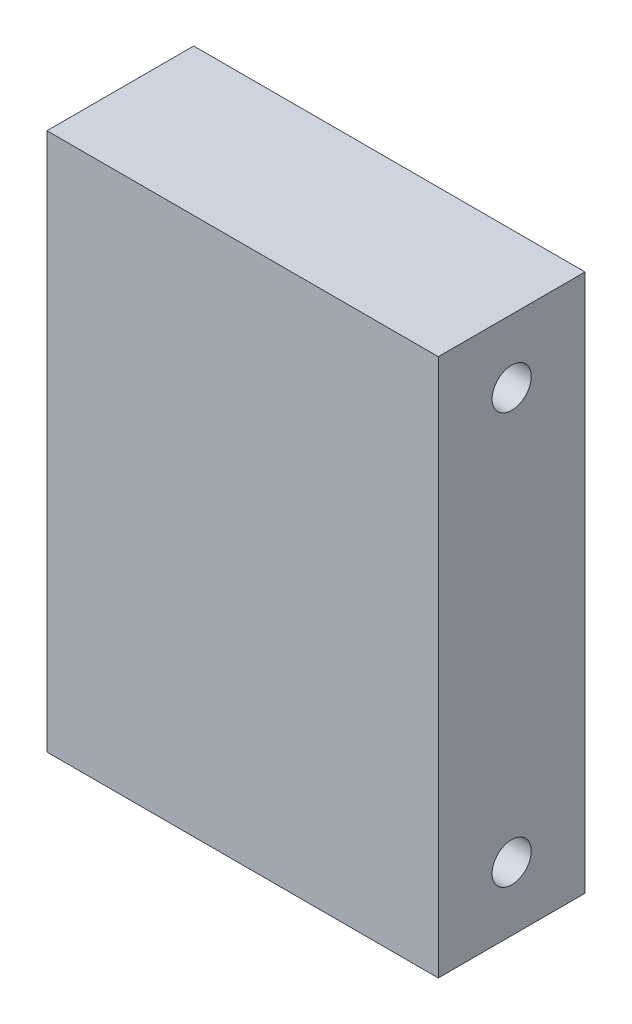
ISO-10303-21;
HEADER;
FILE_DESCRIPTION(('STEP AP214'),'2;1');
FILE_NAME('part.step','',(''),(''),'','','');
FILE_SCHEMA(('AUTOMOTIVE_DESIGN { 1 0 10303 214 1 1 1 1 }'));
ENDSEC;
DATA;
#1=APPLICATION_CONTEXT('core data for automotive mechanical design processes');
#2=APPLICATION_PROTOCOL_DEFINITION('international standard','automotive_design',2000,#1);
#3=PRODUCT_CONTEXT('',#1,'mechanical');
#4=PRODUCT('Part','Part','',(#3));
#5=PRODUCT_RELATED_PRODUCT_CATEGORY('part','',(#4));
#6=PRODUCT_DEFINITION_FORMATION('','',#4);
#7=PRODUCT_DEFINITION_CONTEXT('part definition',#1,'design');
#8=PRODUCT_DEFINITION('design','',#6,#7);
#9=PRODUCT_DEFINITION_SHAPE('','',#8);
#10=(LENGTH_UNIT() NAMED_UNIT(*) SI_UNIT(.MILLI.,.METRE.));
#11=(NAMED_UNIT(*) PLANE_ANGLE_UNIT() SI_UNIT($,.RADIAN.));
#12=(NAMED_UNIT(*) SI_UNIT($,.STERADIAN.) SOLID_ANGLE_UNIT());
#13=UNCERTAINTY_MEASURE_WITH_UNIT(LENGTH_MEASURE(1.E-05),#10,'distance_accuracy_value','');
#14=(GEOMETRIC_REPRESENTATION_CONTEXT(3) GLOBAL_UNCERTAINTY_ASSIGNED_CONTEXT((#13)) GLOBAL_UNIT_ASSIGNED_CONTEXT((#10,
#11,#12)) REPRESENTATION_CONTEXT('',''));
#15=CARTESIAN_POINT('',(0.,0.,0.));
#16=DIRECTION('',(0.,0.,1.));
#17=DIRECTION('',(1.,0.,0.));
#18=AXIS2_PLACEMENT_3D('',#15,#16,#17);
#19=CARTESIAN_POINT('',(-20.,27.5,15.));
#20=DIRECTION('',(1.,0.,0.));
#21=DIRECTION('',(0.,1.,0.));
#22=AXIS2_PLACEMENT_3D('',#19,#20,#21);
#23=PLANE('',#22);
#24=CARTESIAN_POINT('',(-20.,-21.,7.5));
#25=DIRECTION('',(-1.,0.,0.));
#26=DIRECTION('',(0.,-1.,0.));
#27=AXIS2_PLACEMENT_3D('',#24,#25,#26);
#28=CIRCLE('',#27,2.);
#29=CARTESIAN_POINT('',(-20.,-23.,7.5));
#30=VERTEX_POINT('',#29);
#31=EDGE_CURVE('E127',#30,#30,#28,.T.);
#32=ORIENTED_EDGE('',*,*,#31,.F.);
#33=EDGE_LOOP('',(#32));
#34=FACE_BOUND('',#33,.T.);
#35=CARTESIAN_POINT('',(-20.,21.,7.5));
#36=DIRECTION('',(-1.,0.,0.));
#37=DIRECTION('',(0.,-1.,0.));
#38=AXIS2_PLACEMENT_3D('',#35,#36,#37);
#39=CIRCLE('',#38,2.);
#40=CARTESIAN_POINT('',(-20.,19.,7.5));
#41=VERTEX_POINT('',#40);
#42=EDGE_CURVE('E121',#41,#41,#39,.T.);
#43=ORIENTED_EDGE('',*,*,#42,.F.);
#44=EDGE_LOOP('',(#43));
#45=FACE_BOUND('',#44,.T.);
#46=DIRECTION('',(0.,-1.,0.));
#47=VECTOR('',#46,1.);
#48=CARTESIAN_POINT('',(-20.,27.5,0.));
#49=LINE('',#48,#47);
#50=CARTESIAN_POINT('',(-20.,27.5,0.));
#51=VERTEX_POINT('',#50);
#52=CARTESIAN_POINT('',(-20.,-27.5,0.));
#53=VERTEX_POINT('',#52);
#54=EDGE_CURVE('E95',#51,#53,#49,.T.);
#55=ORIENTED_EDGE('',*,*,#54,.T.);
#56=DIRECTION('',(0.,0.,-1.));
#57=VECTOR('',#56,1.);
#58=CARTESIAN_POINT('',(-20.,-27.5,15.));
#59=LINE('',#58,#57);
#60=CARTESIAN_POINT('',(-20.,-27.5,15.));
#61=VERTEX_POINT('',#60);
#62=EDGE_CURVE('E11',#61,#53,#59,.T.);
#63=ORIENTED_EDGE('',*,*,#62,.F.);
#64=DIRECTION('',(0.,-1.,0.));
#65=VECTOR('',#64,1.);
#66=CARTESIAN_POINT('',(-20.,27.5,15.));
#67=LINE('',#66,#65);
#68=CARTESIAN_POINT('',(-20.,27.5,15.));
#69=VERTEX_POINT('',#68);
#70=EDGE_CURVE('E83',#69,#61,#67,.T.);
#71=ORIENTED_EDGE('',*,*,#70,.F.);
#72=DIRECTION('',(0.,0.,-1.));
#73=VECTOR('',#72,1.);
#74=CARTESIAN_POINT('',(-20.,27.5,15.));
#75=LINE('',#74,#73);
#76=EDGE_CURVE('E91',#69,#51,#75,.T.);
#77=ORIENTED_EDGE('',*,*,#76,.T.);
#78=EDGE_LOOP('',(#55,#63,#71,#77));
#79=FACE_BOUND('',#78,.T.);
#80=ADVANCED_FACE('F32',(#34,#45,#79),#23,.F.);
#81=CARTESIAN_POINT('',(-20.,-27.5,15.));
#82=DIRECTION('',(0.,1.,0.));
#83=DIRECTION('',(0.,0.,1.));
#84=AXIS2_PLACEMENT_3D('',#81,#82,#83);
#85=PLANE('',#84);
#86=DIRECTION('',(1.,0.,0.));
#87=VECTOR('',#86,1.);
#88=CARTESIAN_POINT('',(-20.,-27.5,0.));
#89=LINE('',#88,#87);
#90=CARTESIAN_POINT('',(20.,-27.5,0.));
#91=VERTEX_POINT('',#90);
#92=EDGE_CURVE('E87',#53,#91,#89,.T.);
#93=ORIENTED_EDGE('',*,*,#92,.T.);
#94=DIRECTION('',(0.,0.,-1.));
#95=VECTOR('',#94,1.);
#96=CARTESIAN_POINT('',(20.,-27.5,15.));
#97=LINE('',#96,#95);
#98=CARTESIAN_POINT('',(20.,-27.5,15.));
#99=VERTEX_POINT('',#98);
#100=EDGE_CURVE('E40',#99,#91,#97,.T.);
#101=ORIENTED_EDGE('',*,*,#100,.F.);
#102=DIRECTION('',(1.,0.,0.));
#103=VECTOR('',#102,1.);
#104=CARTESIAN_POINT('',(-20.,-27.5,15.));
#105=LINE('',#104,#103);
#106=EDGE_CURVE('E78',#61,#99,#105,.T.);
#107=ORIENTED_EDGE('',*,*,#106,.F.);
#108=ORIENTED_EDGE('',*,*,#62,.T.);
#109=EDGE_LOOP('',(#93,#101,#107,#108));
#110=FACE_BOUND('',#109,.T.);
#111=ADVANCED_FACE('F86',(#110),#85,.F.);
#112=CARTESIAN_POINT('',(20.,27.5,15.));
#113=DIRECTION('',(-1.,0.,0.));
#114=DIRECTION('',(0.,-1.,0.));
#115=AXIS2_PLACEMENT_3D('',#112,#113,#114);
#116=PLANE('',#115);
#117=CARTESIAN_POINT('',(20.,-21.,7.5));
#118=DIRECTION('',(1.,0.,0.));
#119=DIRECTION('',(0.,1.,0.));
#120=AXIS2_PLACEMENT_3D('',#117,#118,#119);
#121=CIRCLE('',#120,2.);
#122=CARTESIAN_POINT('',(20.,-19.,7.5));
#123=VERTEX_POINT('',#122);
#124=EDGE_CURVE('E115',#123,#123,#121,.T.);
#125=ORIENTED_EDGE('',*,*,#124,.F.);
#126=EDGE_LOOP('',(#125));
#127=FACE_BOUND('',#126,.T.);
#128=CARTESIAN_POINT('',(20.,21.,7.5));
#129=DIRECTION('',(1.,0.,0.));
#130=DIRECTION('',(0.,1.,0.));
#131=AXIS2_PLACEMENT_3D('',#128,#129,#130);
#132=CIRCLE('',#131,2.);
#133=CARTESIAN_POINT('',(20.,23.,7.5));
#134=VERTEX_POINT('',#133);
#135=EDGE_CURVE('E109',#134,#134,#132,.T.);
#136=ORIENTED_EDGE('',*,*,#135,.F.);
#137=EDGE_LOOP('',(#136));
#138=FACE_BOUND('',#137,.T.);
#139=DIRECTION('',(0.,1.,0.));
#140=VECTOR('',#139,1.);
#141=CARTESIAN_POINT('',(20.,27.5,0.));
#142=LINE('',#141,#140);
#143=CARTESIAN_POINT('',(20.,27.5,0.));
#144=VERTEX_POINT('',#143);
#145=EDGE_CURVE('E65',#91,#144,#142,.T.);
#146=ORIENTED_EDGE('',*,*,#145,.T.);
#147=DIRECTION('',(0.,0.,-1.));
#148=VECTOR('',#147,1.);
#149=CARTESIAN_POINT('',(20.,27.5,15.));
#150=LINE('',#149,#148);
#151=CARTESIAN_POINT('',(20.,27.5,15.));
#152=VERTEX_POINT('',#151);
#153=EDGE_CURVE('E88',#152,#144,#150,.T.);
#154=ORIENTED_EDGE('',*,*,#153,.F.);
#155=DIRECTION('',(0.,1.,0.));
#156=VECTOR('',#155,1.);
#157=CARTESIAN_POINT('',(20.,27.5,15.));
#158=LINE('',#157,#156);
#159=EDGE_CURVE('E81',#99,#152,#158,.T.);
#160=ORIENTED_EDGE('',*,*,#159,.F.);
#161=ORIENTED_EDGE('',*,*,#100,.T.);
#162=EDGE_LOOP('',(#146,#154,#160,#161));
#163=FACE_BOUND('',#162,.T.);
#164=ADVANCED_FACE('F89',(#127,#138,#163),#116,.F.);
#165=CARTESIAN_POINT('',(-20.,27.5,15.));
#166=DIRECTION('',(0.,-1.,0.));
#167=DIRECTION('',(1.,0.,0.));
#168=AXIS2_PLACEMENT_3D('',#165,#166,#167);
#169=PLANE('',#168);
#170=DIRECTION('',(-1.,0.,0.));
#171=VECTOR('',#170,1.);
#172=CARTESIAN_POINT('',(-20.,27.5,0.));
#173=LINE('',#172,#171);
#174=EDGE_CURVE('E71',#144,#51,#173,.T.);
#175=ORIENTED_EDGE('',*,*,#174,.T.);
#176=ORIENTED_EDGE('',*,*,#76,.F.);
#177=DIRECTION('',(-1.,0.,0.));
#178=VECTOR('',#177,1.);
#179=CARTESIAN_POINT('',(-20.,27.5,15.));
#180=LINE('',#179,#178);
#181=EDGE_CURVE('E48',#152,#69,#180,.T.);
#182=ORIENTED_EDGE('',*,*,#181,.F.);
#183=ORIENTED_EDGE('',*,*,#153,.T.);
#184=EDGE_LOOP('',(#175,#176,#182,#183));
#185=FACE_BOUND('',#184,.T.);
#186=ADVANCED_FACE('F103',(#185),#169,.F.);
#187=CARTESIAN_POINT('',(0.,0.,15.));
#188=DIRECTION('',(0.,0.,1.));
#189=DIRECTION('',(1.,0.,0.));
#190=AXIS2_PLACEMENT_3D('',#187,#188,#189);
#191=PLANE('',#190);
#192=ORIENTED_EDGE('',*,*,#70,.T.);
#193=ORIENTED_EDGE('',*,*,#106,.T.);
#194=ORIENTED_EDGE('',*,*,#159,.T.);
#195=ORIENTED_EDGE('',*,*,#181,.T.);
#196=EDGE_LOOP('',(#192,#193,#194,#195));
#197=FACE_BOUND('',#196,.T.);
#198=ADVANCED_FACE('F79',(#197),#191,.T.);
#199=CARTESIAN_POINT('',(0.,0.,0.));
#200=DIRECTION('',(0.,0.,1.));
#201=DIRECTION('',(1.,0.,0.));
#202=AXIS2_PLACEMENT_3D('',#199,#200,#201);
#203=PLANE('',#202);
#204=ORIENTED_EDGE('',*,*,#54,.F.);
#205=ORIENTED_EDGE('',*,*,#174,.F.);
#206=ORIENTED_EDGE('',*,*,#145,.F.);
#207=ORIENTED_EDGE('',*,*,#92,.F.);
#208=EDGE_LOOP('',(#204,#205,#206,#207));
#209=FACE_BOUND('',#208,.T.);
#210=ADVANCED_FACE('F106',(#209),#203,.F.);
#211=CARTESIAN_POINT('',(15.,21.,7.5));
#212=DIRECTION('',(1.,0.,0.));
#213=DIRECTION('',(0.,1.,0.));
#214=AXIS2_PLACEMENT_3D('',#211,#212,#213);
#215=CYLINDRICAL_SURFACE('',#214,2.);
#216=CARTESIAN_POINT('',(15.,21.,7.5));
#217=DIRECTION('',(1.,0.,0.));
#218=DIRECTION('',(0.,1.,0.));
#219=AXIS2_PLACEMENT_3D('',#216,#217,#218);
#220=CIRCLE('',#219,2.);
#221=CARTESIAN_POINT('',(15.,23.,7.5));
#222=VERTEX_POINT('',#221);
#223=EDGE_CURVE('E98',#222,#222,#220,.T.);
#224=ORIENTED_EDGE('',*,*,#223,.F.);
#225=EDGE_LOOP('',(#224));
#226=FACE_BOUND('',#225,.T.);
#227=ORIENTED_EDGE('',*,*,#135,.T.);
#228=EDGE_LOOP('',(#227));
#229=FACE_BOUND('',#228,.T.);
#230=ADVANCED_FACE('F168',(#226,#229),#215,.F.);
#231=CARTESIAN_POINT('',(15.,21.,7.5));
#232=DIRECTION('',(1.,0.,0.));
#233=DIRECTION('',(0.,1.,0.));
#234=AXIS2_PLACEMENT_3D('',#231,#232,#233);
#235=PLANE('',#234);
#236=ORIENTED_EDGE('',*,*,#223,.T.);
#237=EDGE_LOOP('',(#236));
#238=FACE_BOUND('',#237,.T.);
#239=ADVANCED_FACE('F164',(#238),#235,.T.);
#240=CARTESIAN_POINT('',(15.,-21.,7.5));
#241=DIRECTION('',(1.,0.,0.));
#242=DIRECTION('',(0.,1.,0.));
#243=AXIS2_PLACEMENT_3D('',#240,#241,#242);
#244=CYLINDRICAL_SURFACE('',#243,2.);
#245=CARTESIAN_POINT('',(15.,-21.,7.5));
#246=DIRECTION('',(1.,0.,0.));
#247=DIRECTION('',(0.,1.,0.));
#248=AXIS2_PLACEMENT_3D('',#245,#246,#247);
#249=CIRCLE('',#248,2.);
#250=CARTESIAN_POINT('',(15.,-19.,7.5));
#251=VERTEX_POINT('',#250);
#252=EDGE_CURVE('E112',#251,#251,#249,.T.);
#253=ORIENTED_EDGE('',*,*,#252,.F.);
#254=EDGE_LOOP('',(#253));
#255=FACE_BOUND('',#254,.T.);
#256=ORIENTED_EDGE('',*,*,#124,.T.);
#257=EDGE_LOOP('',(#256));
#258=FACE_BOUND('',#257,.T.);
#259=ADVANCED_FACE('F157',(#255,#258),#244,.F.);
#260=CARTESIAN_POINT('',(15.,-21.,7.5));
#261=DIRECTION('',(1.,0.,0.));
#262=DIRECTION('',(0.,1.,0.));
#263=AXIS2_PLACEMENT_3D('',#260,#261,#262);
#264=PLANE('',#263);
#265=ORIENTED_EDGE('',*,*,#252,.T.);
#266=EDGE_LOOP('',(#265));
#267=FACE_BOUND('',#266,.T.);
#268=ADVANCED_FACE('F148',(#267),#264,.T.);
#269=CARTESIAN_POINT('',(-15.,21.,7.5));
#270=DIRECTION('',(-1.,0.,0.));
#271=DIRECTION('',(0.,-1.,0.));
#272=AXIS2_PLACEMENT_3D('',#269,#270,#271);
#273=CYLINDRICAL_SURFACE('',#272,2.);
#274=CARTESIAN_POINT('',(-15.,21.,7.5));
#275=DIRECTION('',(-1.,0.,0.));
#276=DIRECTION('',(0.,-1.,0.));
#277=AXIS2_PLACEMENT_3D('',#274,#275,#276);
#278=CIRCLE('',#277,2.);
#279=CARTESIAN_POINT('',(-15.,19.,7.5));
#280=VERTEX_POINT('',#279);
#281=EDGE_CURVE('E118',#280,#280,#278,.T.);
#282=ORIENTED_EDGE('',*,*,#281,.F.);
#283=EDGE_LOOP('',(#282));
#284=FACE_BOUND('',#283,.T.);
#285=ORIENTED_EDGE('',*,*,#42,.T.);
#286=EDGE_LOOP('',(#285));
#287=FACE_BOUND('',#286,.T.);
#288=ADVANCED_FACE('F146',(#284,#287),#273,.F.);
#289=CARTESIAN_POINT('',(-15.,21.,7.5));
#290=DIRECTION('',(-1.,0.,0.));
#291=DIRECTION('',(0.,-1.,0.));
#292=AXIS2_PLACEMENT_3D('',#289,#290,#291);
#293=PLANE('',#292);
#294=ORIENTED_EDGE('',*,*,#281,.T.);
#295=EDGE_LOOP('',(#294));
#296=FACE_BOUND('',#295,.T.);
#297=ADVANCED_FACE('F138',(#296),#293,.T.);
#298=CARTESIAN_POINT('',(-15.,-21.,7.5));
#299=DIRECTION('',(-1.,0.,0.));
#300=DIRECTION('',(0.,-1.,0.));
#301=AXIS2_PLACEMENT_3D('',#298,#299,#300);
#302=CYLINDRICAL_SURFACE('',#301,2.);
#303=CARTESIAN_POINT('',(-15.,-21.,7.5));
#304=DIRECTION('',(-1.,0.,0.));
#305=DIRECTION('',(0.,-1.,0.));
#306=AXIS2_PLACEMENT_3D('',#303,#304,#305);
#307=CIRCLE('',#306,2.);
#308=CARTESIAN_POINT('',(-15.,-23.,7.5));
#309=VERTEX_POINT('',#308);
#310=EDGE_CURVE('E124',#309,#309,#307,.T.);
#311=ORIENTED_EDGE('',*,*,#310,.F.);
#312=EDGE_LOOP('',(#311));
#313=FACE_BOUND('',#312,.T.);
#314=ORIENTED_EDGE('',*,*,#31,.T.);
#315=EDGE_LOOP('',(#314));
#316=FACE_BOUND('',#315,.T.);
#317=ADVANCED_FACE('F135',(#313,#316),#302,.F.);
#318=CARTESIAN_POINT('',(-15.,-21.,7.5));
#319=DIRECTION('',(-1.,0.,0.));
#320=DIRECTION('',(0.,-1.,0.));
#321=AXIS2_PLACEMENT_3D('',#318,#319,#320);
#322=PLANE('',#321);
#323=ORIENTED_EDGE('',*,*,#310,.T.);
#324=EDGE_LOOP('',(#323));
#325=FACE_BOUND('',#324,.T.);
#326=ADVANCED_FACE('F133',(#325),#322,.T.);
#327=CLOSED_SHELL('',(#80,#111,#164,#186,#198,#210,#230,#239,#259,#268,#288,#297,#317,#326));
#328=MANIFOLD_SOLID_BREP('B2',#327);
#329=ADVANCED_BREP_SHAPE_REPRESENTATION('',(#18,#328),#14);
#330=SHAPE_DEFINITION_REPRESENTATION(#9,#329);
ENDSEC;
END-ISO-10303-21;
